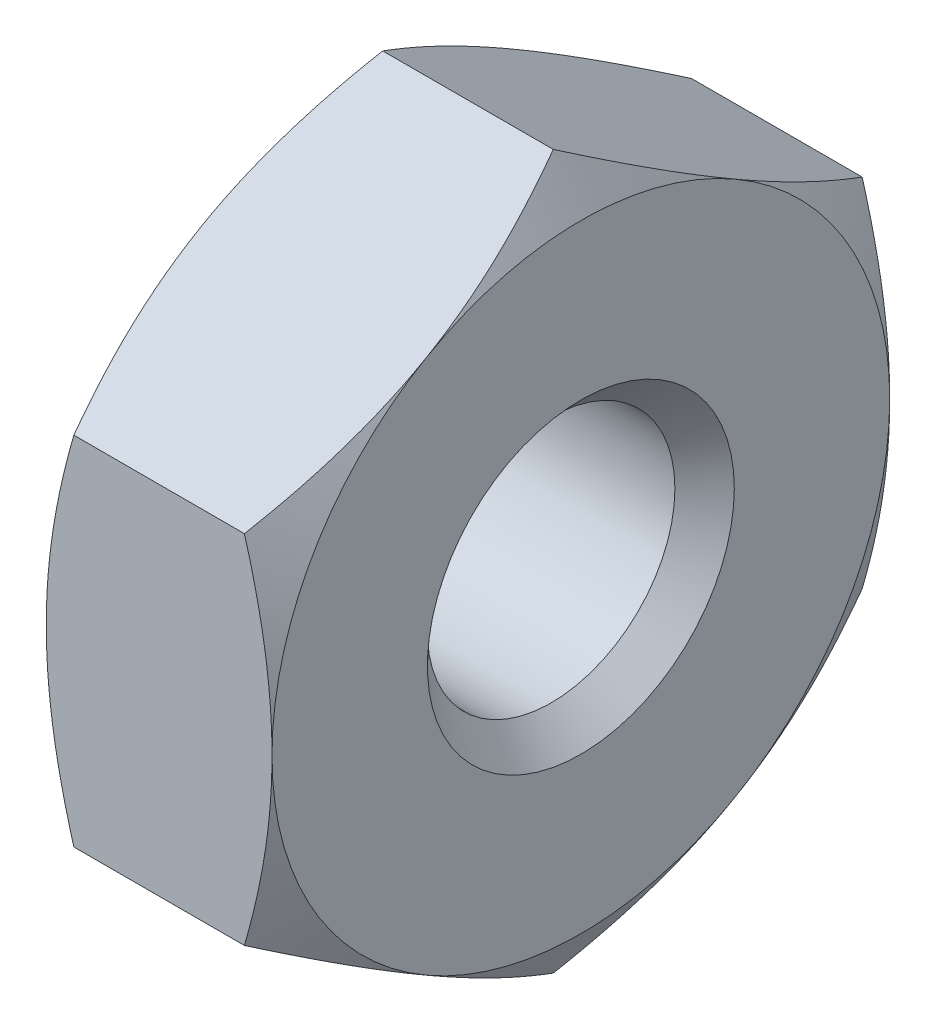
ISO-10303-21;
HEADER;
FILE_DESCRIPTION(('STEP AP214'),'2;1');
FILE_NAME('part.step','',(''),(''),'','','');
FILE_SCHEMA(('AUTOMOTIVE_DESIGN { 1 0 10303 214 1 1 1 1 }'));
ENDSEC;
DATA;
#1=APPLICATION_CONTEXT('core data for automotive mechanical design processes');
#2=APPLICATION_PROTOCOL_DEFINITION('international standard','automotive_design',2000,#1);
#3=PRODUCT_CONTEXT('',#1,'mechanical');
#4=PRODUCT('Part','Part','',(#3));
#5=PRODUCT_RELATED_PRODUCT_CATEGORY('part','',(#4));
#6=PRODUCT_DEFINITION_FORMATION('','',#4);
#7=PRODUCT_DEFINITION_CONTEXT('part definition',#1,'design');
#8=PRODUCT_DEFINITION('design','',#6,#7);
#9=PRODUCT_DEFINITION_SHAPE('','',#8);
#10=(LENGTH_UNIT() NAMED_UNIT(*) SI_UNIT(.MILLI.,.METRE.));
#11=(NAMED_UNIT(*) PLANE_ANGLE_UNIT() SI_UNIT($,.RADIAN.));
#12=(NAMED_UNIT(*) SI_UNIT($,.STERADIAN.) SOLID_ANGLE_UNIT());
#13=UNCERTAINTY_MEASURE_WITH_UNIT(LENGTH_MEASURE(1.E-05),#10,'distance_accuracy_value','');
#14=(GEOMETRIC_REPRESENTATION_CONTEXT(3) GLOBAL_UNCERTAINTY_ASSIGNED_CONTEXT((#13)) GLOBAL_UNIT_ASSIGNED_CONTEXT((#10,
#11,#12)) REPRESENTATION_CONTEXT('',''));
#15=CARTESIAN_POINT('',(0.,0.,0.));
#16=DIRECTION('',(0.,0.,1.));
#17=DIRECTION('',(1.,0.,0.));
#18=AXIS2_PLACEMENT_3D('',#15,#16,#17);
#19=CARTESIAN_POINT('',(2.8956,0.,0.));
#20=DIRECTION('',(1.,0.,0.));
#21=DIRECTION('',(0.,0.,-1.));
#22=AXIS2_PLACEMENT_3D('',#19,#20,#21);
#23=PLANE('',#22);
#24=CARTESIAN_POINT('',(2.8956,0.,0.));
#25=DIRECTION('',(1.,0.,0.));
#26=DIRECTION('',(0.,0.,-1.));
#27=AXIS2_PLACEMENT_3D('',#24,#25,#26);
#28=CIRCLE('',#27,1.9685);
#29=CARTESIAN_POINT('',(2.8956,0.,-1.9685));
#30=VERTEX_POINT('',#29);
#31=EDGE_CURVE('E82',#30,#30,#28,.F.);
#32=ORIENTED_EDGE('',*,*,#31,.T.);
#33=EDGE_LOOP('',(#32));
#34=FACE_BOUND('',#33,.T.);
#35=CARTESIAN_POINT('',(2.8956,0.,0.));
#36=DIRECTION('',(1.,0.,0.));
#37=DIRECTION('',(0.,0.,-1.));
#38=AXIS2_PLACEMENT_3D('',#35,#36,#37);
#39=CIRCLE('',#38,3.9624);
#40=CARTESIAN_POINT('',(2.8956,0.,-3.9624));
#41=VERTEX_POINT('',#40);
#42=CARTESIAN_POINT('',(2.8956,-3.43153905995546,-1.9812));
#43=VERTEX_POINT('',#42);
#44=EDGE_CURVE('E167',#41,#43,#39,.F.);
#45=ORIENTED_EDGE('',*,*,#44,.F.);
#46=CARTESIAN_POINT('',(2.8956,3.43153905995546,-1.9812));
#47=VERTEX_POINT('',#46);
#48=EDGE_CURVE('E180',#47,#41,#39,.F.);
#49=ORIENTED_EDGE('',*,*,#48,.F.);
#50=CARTESIAN_POINT('',(2.8956,3.43153905995546,1.9812));
#51=VERTEX_POINT('',#50);
#52=EDGE_CURVE('E186',#51,#47,#39,.F.);
#53=ORIENTED_EDGE('',*,*,#52,.F.);
#54=CARTESIAN_POINT('',(2.8956,0.,0.));
#55=DIRECTION('',(-1.,0.,0.));
#56=DIRECTION('',(0.,0.,1.));
#57=AXIS2_PLACEMENT_3D('',#54,#55,#56);
#58=CIRCLE('',#57,3.9624);
#59=CARTESIAN_POINT('',(2.8956,0.,3.9624));
#60=VERTEX_POINT('',#59);
#61=EDGE_CURVE('E625',#60,#51,#58,.T.);
#62=ORIENTED_EDGE('',*,*,#61,.F.);
#63=CARTESIAN_POINT('',(2.8956,-3.43153905995546,1.9812));
#64=VERTEX_POINT('',#63);
#65=EDGE_CURVE('E622',#64,#60,#39,.F.);
#66=ORIENTED_EDGE('',*,*,#65,.F.);
#67=EDGE_CURVE('E190',#43,#64,#39,.F.);
#68=ORIENTED_EDGE('',*,*,#67,.F.);
#69=EDGE_LOOP('',(#45,#49,#53,#62,#66,#68));
#70=FACE_BOUND('',#69,.T.);
#71=ADVANCED_FACE('F73',(#34,#70),#23,.T.);
#72=CARTESIAN_POINT('',(0.,0.,0.));
#73=DIRECTION('',(1.,0.,0.));
#74=DIRECTION('',(0.,0.,-1.));
#75=AXIS2_PLACEMENT_3D('',#72,#73,#74);
#76=PLANE('',#75);
#77=CARTESIAN_POINT('',(0.,0.,0.));
#78=DIRECTION('',(1.,0.,0.));
#79=DIRECTION('',(0.,0.,-1.));
#80=AXIS2_PLACEMENT_3D('',#77,#78,#79);
#81=CIRCLE('',#80,1.9685);
#82=CARTESIAN_POINT('',(0.,0.,-1.9685));
#83=VERTEX_POINT('',#82);
#84=EDGE_CURVE('E13',#83,#83,#81,.T.);
#85=ORIENTED_EDGE('',*,*,#84,.T.);
#86=EDGE_LOOP('',(#85));
#87=FACE_BOUND('',#86,.T.);
#88=CARTESIAN_POINT('',(0.,0.,0.));
#89=DIRECTION('',(-1.,0.,0.));
#90=DIRECTION('',(0.,0.,1.));
#91=AXIS2_PLACEMENT_3D('',#88,#89,#90);
#92=CIRCLE('',#91,3.9624);
#93=CARTESIAN_POINT('',(0.,3.43153905995546,-1.9812));
#94=VERTEX_POINT('',#93);
#95=CARTESIAN_POINT('',(0.,0.,-3.9624));
#96=VERTEX_POINT('',#95);
#97=EDGE_CURVE('E362',#94,#96,#92,.T.);
#98=ORIENTED_EDGE('',*,*,#97,.T.);
#99=CARTESIAN_POINT('',(0.,-3.43153905995546,-1.9812));
#100=VERTEX_POINT('',#99);
#101=EDGE_CURVE('E364',#96,#100,#92,.T.);
#102=ORIENTED_EDGE('',*,*,#101,.T.);
#103=CARTESIAN_POINT('',(0.,-3.43153905995546,1.9812));
#104=VERTEX_POINT('',#103);
#105=EDGE_CURVE('E198',#100,#104,#92,.T.);
#106=ORIENTED_EDGE('',*,*,#105,.T.);
#107=CARTESIAN_POINT('',(0.,0.,3.9624));
#108=VERTEX_POINT('',#107);
#109=EDGE_CURVE('E196',#104,#108,#92,.T.);
#110=ORIENTED_EDGE('',*,*,#109,.T.);
#111=CARTESIAN_POINT('',(0.,3.43153905995546,1.9812));
#112=VERTEX_POINT('',#111);
#113=EDGE_CURVE('E200',#108,#112,#92,.T.);
#114=ORIENTED_EDGE('',*,*,#113,.T.);
#115=EDGE_CURVE('E366',#112,#94,#92,.T.);
#116=ORIENTED_EDGE('',*,*,#115,.T.);
#117=EDGE_LOOP('',(#98,#102,#106,#110,#114,#116));
#118=FACE_BOUND('',#117,.T.);
#119=ADVANCED_FACE('F303',(#87,#118),#76,.F.);
#120=CARTESIAN_POINT('',(2.8956,-2.28769270663697,3.9624));
#121=DIRECTION('',(0.,0.866025403784439,-0.499999999999999));
#122=DIRECTION('',(0.,0.499999999999999,0.866025403784439));
#123=AXIS2_PLACEMENT_3D('',#120,#121,#122);
#124=PLANE('',#123);
#125=DIRECTION('',(-1.,0.,0.));
#126=VECTOR('',#125,1.);
#127=CARTESIAN_POINT('',(2.8956,-4.57538541327394,0.));
#128=LINE('',#127,#126);
#129=CARTESIAN_POINT('',(2.54169270663698,-4.57538541327394,0.));
#130=VERTEX_POINT('',#129);
#131=CARTESIAN_POINT('',(0.353907293363023,-4.57538541327394,0.));
#132=VERTEX_POINT('',#131);
#133=EDGE_CURVE('E343',#130,#132,#128,.T.);
#134=ORIENTED_EDGE('',*,*,#133,.F.);
#135=CARTESIAN_POINT('',(2.54162603744665,-4.57550088332778,-0.00020000000000168));
#136=CARTESIAN_POINT('',(2.5996894991212,-4.47496869496618,0.173926858038369));
#137=CARTESIAN_POINT('',(2.65249601498795,-4.37356871848328,0.349556769193048));
#138=CARTESIAN_POINT('',(2.74467012185692,-4.16901293390611,0.703857781062829));
#139=CARTESIAN_POINT('',(2.78400510539269,-4.06585349125788,0.882535177010038));
#140=CARTESIAN_POINT('',(2.84523546926796,-3.8608130677357,1.2376756081559));
#141=CARTESIAN_POINT('',(2.86753837460415,-3.75896363405663,1.41408400201017));
#142=CARTESIAN_POINT('',(2.89416294973538,-3.5547855524458,1.76773081315208));
#143=CARTESIAN_POINT('',(2.89850666746162,-3.45245764660112,1.94496794510718));
#144=CARTESIAN_POINT('',(2.88946818984585,-3.26125371237131,2.27614287380026));
#145=CARTESIAN_POINT('',(2.87830524671096,-3.17234905538404,2.43013025673172));
#146=CARTESIAN_POINT('',(2.84292590299917,-2.99511895214281,2.7371018001762));
#147=CARTESIAN_POINT('',(2.81869741783093,-2.90679411885186,2.89008489900617));
#148=CARTESIAN_POINT('',(2.75812832849033,-2.72919862756264,3.19768931311426));
#149=CARTESIAN_POINT('',(2.72153098455844,-2.63995044607733,3.35227169792995));
#150=CARTESIAN_POINT('',(2.63846950108705,-2.46278516738017,3.65913096197053));
#151=CARTESIAN_POINT('',(2.59202487701409,-2.37486580057578,3.81141177224502));
#152=CARTESIAN_POINT('',(2.54162603744665,-2.28757723658314,3.9626));
#153=B_SPLINE_CURVE_WITH_KNOTS('',3,(#135,#136,#137,#138,#139,#140,#141,#142,#143,#144,#145,
#146,#147,#148,#149,#150,#151,#152),.UNSPECIFIED.,.F.,.F.,(4,2,2,2,2,2,2,2,4),(0.,
0.628087934683978,1.25768556849603,1.87170106915143,2.48496253800265,3.01893254763583,
3.55339728643647,4.09971704494744,4.64496405448818),.UNSPECIFIED.);
#154=EDGE_CURVE('E621',#130,#64,#153,.T.);
#155=ORIENTED_EDGE('',*,*,#154,.T.);
#156=CARTESIAN_POINT('',(2.54169270663697,-2.28769270663697,3.9624));
#157=VERTEX_POINT('',#156);
#158=EDGE_CURVE('E97',#64,#157,#153,.T.);
#159=ORIENTED_EDGE('',*,*,#158,.T.);
#160=DIRECTION('',(-1.,0.,0.));
#161=VECTOR('',#160,1.);
#162=CARTESIAN_POINT('',(2.8956,-2.28769270663697,3.9624));
#163=LINE('',#162,#161);
#164=CARTESIAN_POINT('',(0.353907293363025,-2.28769270663697,3.9624));
#165=VERTEX_POINT('',#164);
#166=EDGE_CURVE('E379',#157,#165,#163,.T.);
#167=ORIENTED_EDGE('',*,*,#166,.T.);
#168=CARTESIAN_POINT('',(0.353973962553349,-4.57550088332778,-0.000200000000001666));
#169=CARTESIAN_POINT('',(0.2959105008788,-4.47496869496618,0.173926858038369));
#170=CARTESIAN_POINT('',(0.243103985012051,-4.37356871848328,0.349556769193048));
#171=CARTESIAN_POINT('',(0.150929878143084,-4.16901293390611,0.703857781062829));
#172=CARTESIAN_POINT('',(0.111594894607311,-4.06585349125788,0.882535177010038));
#173=CARTESIAN_POINT('',(0.0503645307320357,-3.8608130677357,1.2376756081559));
#174=CARTESIAN_POINT('',(0.0280616253958538,-3.75896363405663,1.41408400201017));
#175=CARTESIAN_POINT('',(0.00143705026462416,-3.5547855524458,1.76773081315208));
#176=CARTESIAN_POINT('',(-0.00290666746161531,-3.45245764660112,1.94496794510718));
#177=CARTESIAN_POINT('',(0.00613181015415201,-3.26125371237131,2.27614287380026));
#178=CARTESIAN_POINT('',(0.0172947532890406,-3.17234905538404,2.43013025673172));
#179=CARTESIAN_POINT('',(0.052674097000834,-2.99511895214281,2.7371018001762));
#180=CARTESIAN_POINT('',(0.0769025821690729,-2.90679411885186,2.89008489900617));
#181=CARTESIAN_POINT('',(0.137471671509675,-2.72919862756264,3.19768931311426));
#182=CARTESIAN_POINT('',(0.174069015441556,-2.63995044607733,3.35227169792995));
#183=CARTESIAN_POINT('',(0.257130498912947,-2.46278516738017,3.65913096197053));
#184=CARTESIAN_POINT('',(0.303575122985905,-2.37486580057578,3.81141177224502));
#185=CARTESIAN_POINT('',(0.353973962553351,-2.28757723658314,3.9626));
#186=B_SPLINE_CURVE_WITH_KNOTS('',3,(#168,#169,#170,#171,#172,#173,#174,#175,#176,#177,#178,
#179,#180,#181,#182,#183,#184,#185),.UNSPECIFIED.,.F.,.F.,(4,2,2,2,2,2,2,2,4),(0.,
0.628087934683978,1.25768556849603,1.87170106915143,2.48496253800265,3.01893254763583,
3.55339728643647,4.09971704494744,4.64496405448818),.UNSPECIFIED.);
#187=EDGE_CURVE('E277',#104,#165,#186,.T.);
#188=ORIENTED_EDGE('',*,*,#187,.F.);
#189=EDGE_CURVE('E374',#132,#104,#186,.T.);
#190=ORIENTED_EDGE('',*,*,#189,.F.);
#191=EDGE_LOOP('',(#134,#155,#159,#167,#188,#190));
#192=FACE_BOUND('',#191,.T.);
#193=ADVANCED_FACE('F298',(#192),#124,.F.);
#194=CARTESIAN_POINT('',(2.8956,-4.57538541327394,0.));
#195=DIRECTION('',(0.,0.866025403784439,0.5));
#196=DIRECTION('',(0.,-0.5,0.866025403784439));
#197=AXIS2_PLACEMENT_3D('',#194,#195,#196);
#198=PLANE('',#197);
#199=DIRECTION('',(-1.,0.,0.));
#200=VECTOR('',#199,1.);
#201=CARTESIAN_POINT('',(2.8956,-2.28769270663697,-3.9624));
#202=LINE('',#201,#200);
#203=CARTESIAN_POINT('',(2.54169270663698,-2.28769270663697,-3.9624));
#204=VERTEX_POINT('',#203);
#205=CARTESIAN_POINT('',(0.353907293363024,-2.28769270663697,-3.9624));
#206=VERTEX_POINT('',#205);
#207=EDGE_CURVE('E407',#204,#206,#202,.T.);
#208=ORIENTED_EDGE('',*,*,#207,.F.);
#209=CARTESIAN_POINT('',(2.54162603744665,-2.28757723658313,-3.9626));
#210=CARTESIAN_POINT('',(2.5996894991212,-2.38810942494473,-3.78847314196163));
#211=CARTESIAN_POINT('',(2.65249601498795,-2.48950940142764,-3.61284323080695));
#212=CARTESIAN_POINT('',(2.74467012185691,-2.69406518600481,-3.25854221893717));
#213=CARTESIAN_POINT('',(2.78400510539269,-2.79722462865303,-3.07986482298996));
#214=CARTESIAN_POINT('',(2.84523546926796,-3.00226505217521,-2.7247243918441));
#215=CARTESIAN_POINT('',(2.86753837460415,-3.10411448585428,-2.54831599798983));
#216=CARTESIAN_POINT('',(2.89416294973538,-3.30829256746512,-2.19466918684792));
#217=CARTESIAN_POINT('',(2.89850666746162,-3.41062047330979,-2.01743205489282));
#218=CARTESIAN_POINT('',(2.88946818984585,-3.6018244075396,-1.68625712619973));
#219=CARTESIAN_POINT('',(2.87830524671096,-3.69072906452688,-1.53226974326828));
#220=CARTESIAN_POINT('',(2.84292590299917,-3.86795916776811,-1.2252981998238));
#221=CARTESIAN_POINT('',(2.81869741783093,-3.95628400105906,-1.07231510099383));
#222=CARTESIAN_POINT('',(2.75812832849033,-4.13387949234828,-0.764710686885743));
#223=CARTESIAN_POINT('',(2.72153098455844,-4.22312767383359,-0.610128302070049));
#224=CARTESIAN_POINT('',(2.63846950108705,-4.40029295253075,-0.303269038029472));
#225=CARTESIAN_POINT('',(2.5920248770141,-4.48821231933514,-0.150988227754982));
#226=CARTESIAN_POINT('',(2.54162603744665,-4.57550088332778,0.000199999999998811));
#227=B_SPLINE_CURVE_WITH_KNOTS('',3,(#209,#210,#211,#212,#213,#214,#215,#216,#217,#218,#219,
#220,#221,#222,#223,#224,#225,#226),.UNSPECIFIED.,.F.,.F.,(4,2,2,2,2,2,2,2,4),(0.,
0.628087934683978,1.25768556849603,1.87170106915143,2.48496253800265,3.01893254763583,
3.55339728643647,4.09971704494744,4.64496405448818),.UNSPECIFIED.);
#228=EDGE_CURVE('E170',#204,#43,#227,.T.);
#229=ORIENTED_EDGE('',*,*,#228,.T.);
#230=EDGE_CURVE('E89',#43,#130,#227,.T.);
#231=ORIENTED_EDGE('',*,*,#230,.T.);
#232=ORIENTED_EDGE('',*,*,#133,.T.);
#233=CARTESIAN_POINT('',(0.35397396255335,-2.28757723658313,-3.9626));
#234=CARTESIAN_POINT('',(0.295910500878801,-2.38810942494473,-3.78847314196163));
#235=CARTESIAN_POINT('',(0.243103985012052,-2.48950940142764,-3.61284323080695));
#236=CARTESIAN_POINT('',(0.150929878143085,-2.69406518600481,-3.25854221893717));
#237=CARTESIAN_POINT('',(0.111594894607312,-2.79722462865303,-3.07986482298996));
#238=CARTESIAN_POINT('',(0.0503645307320365,-3.00226505217521,-2.7247243918441));
#239=CARTESIAN_POINT('',(0.0280616253958544,-3.10411448585428,-2.54831599798983));
#240=CARTESIAN_POINT('',(0.00143705026462438,-3.30829256746512,-2.19466918684792));
#241=CARTESIAN_POINT('',(-0.00290666746161511,-3.41062047330979,-2.01743205489282));
#242=CARTESIAN_POINT('',(0.00613181015415195,-3.6018244075396,-1.68625712619973));
#243=CARTESIAN_POINT('',(0.0172947532890404,-3.69072906452688,-1.53226974326828));
#244=CARTESIAN_POINT('',(0.0526740970008337,-3.86795916776811,-1.2252981998238));
#245=CARTESIAN_POINT('',(0.0769025821690728,-3.95628400105906,-1.07231510099383));
#246=CARTESIAN_POINT('',(0.137471671509675,-4.13387949234828,-0.764710686885743));
#247=CARTESIAN_POINT('',(0.174069015441555,-4.22312767383359,-0.610128302070049));
#248=CARTESIAN_POINT('',(0.257130498912946,-4.40029295253075,-0.303269038029472));
#249=CARTESIAN_POINT('',(0.303575122985904,-4.48821231933514,-0.150988227754982));
#250=CARTESIAN_POINT('',(0.35397396255335,-4.57550088332778,0.000199999999998811));
#251=B_SPLINE_CURVE_WITH_KNOTS('',3,(#233,#234,#235,#236,#237,#238,#239,#240,#241,#242,#243,
#244,#245,#246,#247,#248,#249,#250),.UNSPECIFIED.,.F.,.F.,(4,2,2,2,2,2,2,2,4),(0.,
0.628087934683978,1.25768556849603,1.87170106915143,2.48496253800265,3.01893254763583,
3.55339728643647,4.09971704494744,4.64496405448818),.UNSPECIFIED.);
#252=EDGE_CURVE('E274',#100,#132,#251,.T.);
#253=ORIENTED_EDGE('',*,*,#252,.F.);
#254=EDGE_CURVE('E288',#206,#100,#251,.T.);
#255=ORIENTED_EDGE('',*,*,#254,.F.);
#256=EDGE_LOOP('',(#208,#229,#231,#232,#253,#255));
#257=FACE_BOUND('',#256,.T.);
#258=ADVANCED_FACE('F295',(#257),#198,.F.);
#259=CARTESIAN_POINT('',(2.8956,-2.28769270663697,-3.9624));
#260=DIRECTION('',(0.,0.,1.));
#261=DIRECTION('',(0.,-1.,0.));
#262=AXIS2_PLACEMENT_3D('',#259,#260,#261);
#263=PLANE('',#262);
#264=DIRECTION('',(-1.,0.,0.));
#265=VECTOR('',#264,1.);
#266=CARTESIAN_POINT('',(2.8956,2.28769270663697,-3.9624));
#267=LINE('',#266,#265);
#268=CARTESIAN_POINT('',(2.54169270663698,2.28769270663697,-3.9624));
#269=VERTEX_POINT('',#268);
#270=CARTESIAN_POINT('',(0.353907293363024,2.28769270663697,-3.9624));
#271=VERTEX_POINT('',#270);
#272=EDGE_CURVE('E195',#269,#271,#267,.T.);
#273=ORIENTED_EDGE('',*,*,#272,.F.);
#274=CARTESIAN_POINT('',(0.182289948209158,7.70256269104045,-3.9624));
#275=CARTESIAN_POINT('',(0.274606353263149,7.52272497184072,-3.9624));
#276=CARTESIAN_POINT('',(0.366407238824421,7.34262025346435,-3.9624));
#277=CARTESIAN_POINT('',(0.548719844270929,6.98175542812287,-3.9624));
#278=CARTESIAN_POINT('',(0.639231538678051,6.80099530829347,-3.9624));
#279=CARTESIAN_POINT('',(0.818853443103621,6.43840364833198,-3.9624));
#280=CARTESIAN_POINT('',(0.907961067564235,6.25657082507101,-3.9624));
#281=CARTESIAN_POINT('',(1.08426553414595,5.89197647389006,-3.9624));
#282=CARTESIAN_POINT('',(1.17146234874555,5.70921493264035,-3.9624));
#283=CARTESIAN_POINT('',(1.34795240446268,5.33306014822794,-3.9624));
#284=CARTESIAN_POINT('',(1.43711946956753,5.13960753557344,-3.9624));
#285=CARTESIAN_POINT('',(1.61211975184191,4.75120693210959,-3.9624));
#286=CARTESIAN_POINT('',(1.69795314000825,4.55625901861571,-3.9624));
#287=CARTESIAN_POINT('',(1.86527992120165,4.16465576275669,-3.9624));
#288=CARTESIAN_POINT('',(1.9467762086188,3.96800166359602,-3.9624));
#289=CARTESIAN_POINT('',(2.10421175246153,3.57241334445207,-3.9624));
#290=CARTESIAN_POINT('',(2.18014968539791,3.37347859438533,-3.9624));
#291=CARTESIAN_POINT('',(2.33689351512035,2.93918281435936,-3.9624));
#292=CARTESIAN_POINT('',(2.41636264061333,2.70333360112805,-3.9624));
#293=CARTESIAN_POINT('',(2.56150192237576,2.22743533132434,-3.9624));
#294=CARTESIAN_POINT('',(2.62717919348315,1.98738850976269,-3.9624));
#295=CARTESIAN_POINT('',(2.7111951154525,1.62634331124381,-3.9624));
#296=CARTESIAN_POINT('',(2.73660660323574,1.50698440014674,-3.9624));
#297=CARTESIAN_POINT('',(2.78233226293366,1.26728597187931,-3.9624));
#298=CARTESIAN_POINT('',(2.80264656374962,1.14694647958607,-3.9624));
#299=CARTESIAN_POINT('',(2.83759555505393,0.905492991729085,-3.9624));
#300=CARTESIAN_POINT('',(2.85223276376496,0.784379363842824,-3.9624));
#301=CARTESIAN_POINT('',(2.87536599604673,0.541568023368281,-3.9624));
#302=CARTESIAN_POINT('',(2.88386238616633,0.419870346078813,-3.9624));
#303=CARTESIAN_POINT('',(2.894481081469,0.174637610857229,-3.9624));
#304=CARTESIAN_POINT('',(2.89652067296957,0.0510989218939636,-3.9624));
#305=CARTESIAN_POINT('',(2.89391554504624,-0.195906835324923,-3.9624));
#306=CARTESIAN_POINT('',(2.88927081490336,-0.319373903465375,-3.9624));
#307=CARTESIAN_POINT('',(2.87346861657513,-0.565916129075409,-3.9624));
#308=CARTESIAN_POINT('',(2.86230962630852,-0.688991188190953,-3.9624));
#309=CARTESIAN_POINT('',(2.83387315400649,-0.934439508744345,-3.9624));
#310=CARTESIAN_POINT('',(2.81659469959799,-1.05681265550732,-3.9624));
#311=CARTESIAN_POINT('',(2.75558987521174,-1.42734959834767,-3.9624));
#312=CARTESIAN_POINT('',(2.70303858556925,-1.67407818673978,-3.9624));
#313=CARTESIAN_POINT('',(2.58007371839412,-2.16293128009702,-3.9624));
#314=CARTESIAN_POINT('',(2.50965526515473,-2.40505450890363,-3.9624));
#315=CARTESIAN_POINT('',(2.3602472122273,-2.87114242215661,-3.9624));
#316=CARTESIAN_POINT('',(2.28199113151834,-3.09534609314044,-3.9624));
#317=CARTESIAN_POINT('',(2.11694852039893,-3.54061146906983,-3.9624));
#318=CARTESIAN_POINT('',(2.03016009682278,-3.76167246420437,-3.9624));
#319=CARTESIAN_POINT('',(1.85019857157568,-4.2014272519529,-3.9624));
#320=CARTESIAN_POINT('',(1.75701895819249,-4.42011835928111,-3.9624));
#321=CARTESIAN_POINT('',(1.56594858890574,-4.85539795505858,-3.9624));
#322=CARTESIAN_POINT('',(1.46805826315899,-5.07198663332803,-3.9624));
#323=CARTESIAN_POINT('',(1.27418580524747,-5.49159898606032,-3.9624));
#324=CARTESIAN_POINT('',(1.17839620920984,-5.69471196773203,-3.9624));
#325=CARTESIAN_POINT('',(0.984298664103829,-6.09973608782074,-3.9624));
#326=CARTESIAN_POINT('',(0.885990638182508,-6.30164718932864,-3.9624));
#327=CARTESIAN_POINT('',(0.687687341744048,-6.70385965514922,-3.9624));
#328=CARTESIAN_POINT('',(0.587698241260454,-6.90416406847561,-3.9624));
#329=CARTESIAN_POINT('',(0.386111251183596,-7.30394148741969,-3.9624));
#330=CARTESIAN_POINT('',(0.28451349563511,-7.5034145605791,-3.9624));
#331=CARTESIAN_POINT('',(0.182289948209156,-7.70256269104045,-3.9624));
#332=B_SPLINE_CURVE_WITH_KNOTS('',3,(#274,#275,#276,#277,#278,#279,#280,#281,#282,#283,#284,
#285,#286,#287,#288,#289,#290,#291,#292,#293,#294,#295,#296,#297,#298,#299,#300,#301,#302,#303,
#304,#305,#306,#307,#308,#309,#310,#311,#312,#313,#314,#315,#316,#317,#318,#319,#320,#321,#322,
#323,#324,#325,#326,#327,#328,#329,#330,#331),.UNSPECIFIED.,.F.,.F.,(4,2,2,2,2,2,2,2,2,2,2,2,2,
2,2,2,2,2,2,2,2,2,2,2,2,2,2,2,4),(0.,0.60644712097485,1.21290621050109,1.82037547020059,
2.42785347357265,3.06686887199352,3.70585144951122,4.34440210851369,4.98310432030336,
5.7294578821321,6.4754254696883,6.84143647309758,7.20743821962664,7.57327743032472,
7.93909480207339,8.30957983680194,8.68006546564152,9.05063769450259,9.42126883313732,
10.1770644799548,10.9330665953962,11.6452429549003,12.3575776910582,13.0706492965039,
13.7836559112031,14.4573372133535,15.1310390982522,15.8026540224422,16.4742132743026),.UNSPECIFIED.);
#333=EDGE_CURVE('E174',#269,#41,#332,.T.);
#334=ORIENTED_EDGE('',*,*,#333,.T.);
#335=EDGE_CURVE('E163',#41,#204,#332,.T.);
#336=ORIENTED_EDGE('',*,*,#335,.T.);
#337=ORIENTED_EDGE('',*,*,#207,.T.);
#338=CARTESIAN_POINT('',(2.71331005179084,7.70256269104045,-3.9624));
#339=CARTESIAN_POINT('',(2.62099364673685,7.52272497184072,-3.9624));
#340=CARTESIAN_POINT('',(2.52919276117558,7.34262025346435,-3.9624));
#341=CARTESIAN_POINT('',(2.34688015572907,6.98175542812287,-3.9624));
#342=CARTESIAN_POINT('',(2.25636846132195,6.80099530829348,-3.9624));
#343=CARTESIAN_POINT('',(2.07674655689638,6.43840364833199,-3.9624));
#344=CARTESIAN_POINT('',(1.98763893243576,6.25657082507101,-3.9624));
#345=CARTESIAN_POINT('',(1.81133446585405,5.89197647389006,-3.9624));
#346=CARTESIAN_POINT('',(1.72413765125445,5.70921493264035,-3.9624));
#347=CARTESIAN_POINT('',(1.54764759553732,5.33306014822794,-3.9624));
#348=CARTESIAN_POINT('',(1.45848053043247,5.13960753557344,-3.9624));
#349=CARTESIAN_POINT('',(1.28348024815809,4.75120693210959,-3.9624));
#350=CARTESIAN_POINT('',(1.19764685999175,4.55625901861571,-3.9624));
#351=CARTESIAN_POINT('',(1.03032007879835,4.16465576275669,-3.9624));
#352=CARTESIAN_POINT('',(0.9488237913812,3.96800166359602,-3.9624));
#353=CARTESIAN_POINT('',(0.791388247538468,3.57241334445207,-3.9624));
#354=CARTESIAN_POINT('',(0.715450314602091,3.37347859438533,-3.9624));
#355=CARTESIAN_POINT('',(0.558706484879653,2.93918281435936,-3.9624));
#356=CARTESIAN_POINT('',(0.479237359386666,2.70333360112805,-3.9624));
#357=CARTESIAN_POINT('',(0.334098077624243,2.22743533132434,-3.9624));
#358=CARTESIAN_POINT('',(0.268420806516853,1.98738850976269,-3.9624));
#359=CARTESIAN_POINT('',(0.184404884547504,1.62634331124381,-3.9624));
#360=CARTESIAN_POINT('',(0.158993396764256,1.50698440014674,-3.9624));
#361=CARTESIAN_POINT('',(0.113267737066343,1.26728597187931,-3.9624));
#362=CARTESIAN_POINT('',(0.0929534362503816,1.14694647958607,-3.9624));
#363=CARTESIAN_POINT('',(0.0580044449460747,0.905492991729085,-3.9624));
#364=CARTESIAN_POINT('',(0.0433672362350353,0.784379363842825,-3.9624));
#365=CARTESIAN_POINT('',(0.0202340039532675,0.541568023368281,-3.9624));
#366=CARTESIAN_POINT('',(0.0117376138336693,0.419870346078813,-3.9624));
#367=CARTESIAN_POINT('',(0.00111891853099631,0.17463761085723,-3.9624));
#368=CARTESIAN_POINT('',(-0.000920672969569272,0.0510989218939641,-3.9624));
#369=CARTESIAN_POINT('',(0.0016844549537588,-0.195906835324923,-3.9624));
#370=CARTESIAN_POINT('',(0.00632918509664104,-0.319373903465375,-3.9624));
#371=CARTESIAN_POINT('',(0.022131383424871,-0.565916129075409,-3.9624));
#372=CARTESIAN_POINT('',(0.0332903736914801,-0.688991188190952,-3.9624));
#373=CARTESIAN_POINT('',(0.0617268459935065,-0.934439508744344,-3.9624));
#374=CARTESIAN_POINT('',(0.0790053004020125,-1.05681265550732,-3.9624));
#375=CARTESIAN_POINT('',(0.140010124788258,-1.42734959834767,-3.9624));
#376=CARTESIAN_POINT('',(0.192561414430751,-1.67407818673978,-3.9624));
#377=CARTESIAN_POINT('',(0.315526281605878,-2.16293128009702,-3.9624));
#378=CARTESIAN_POINT('',(0.385944734845269,-2.40505450890363,-3.9624));
#379=CARTESIAN_POINT('',(0.535352787772696,-2.87114242215661,-3.9624));
#380=CARTESIAN_POINT('',(0.613608868481664,-3.09534609314044,-3.9624));
#381=CARTESIAN_POINT('',(0.778651479601071,-3.54061146906983,-3.9624));
#382=CARTESIAN_POINT('',(0.865439903177224,-3.76167246420437,-3.9624));
#383=CARTESIAN_POINT('',(1.04540142842432,-4.2014272519529,-3.9624));
#384=CARTESIAN_POINT('',(1.13858104180751,-4.42011835928111,-3.9624));
#385=CARTESIAN_POINT('',(1.32965141109426,-4.85539795505858,-3.9624));
#386=CARTESIAN_POINT('',(1.42754173684101,-5.07198663332803,-3.9624));
#387=CARTESIAN_POINT('',(1.62141419475253,-5.49159898606032,-3.9624));
#388=CARTESIAN_POINT('',(1.71720379079016,-5.69471196773203,-3.9624));
#389=CARTESIAN_POINT('',(1.91130133589617,-6.09973608782074,-3.9624));
#390=CARTESIAN_POINT('',(2.00960936181749,-6.30164718932864,-3.9624));
#391=CARTESIAN_POINT('',(2.20791265825595,-6.70385965514922,-3.9624));
#392=CARTESIAN_POINT('',(2.30790175873955,-6.90416406847561,-3.9624));
#393=CARTESIAN_POINT('',(2.5094887488164,-7.30394148741968,-3.9624));
#394=CARTESIAN_POINT('',(2.61108650436489,-7.50341456057909,-3.9624));
#395=CARTESIAN_POINT('',(2.71331005179084,-7.70256269104045,-3.9624));
#396=B_SPLINE_CURVE_WITH_KNOTS('',3,(#338,#339,#340,#341,#342,#343,#344,#345,#346,#347,#348,
#349,#350,#351,#352,#353,#354,#355,#356,#357,#358,#359,#360,#361,#362,#363,#364,#365,#366,#367,
#368,#369,#370,#371,#372,#373,#374,#375,#376,#377,#378,#379,#380,#381,#382,#383,#384,#385,#386,
#387,#388,#389,#390,#391,#392,#393,#394,#395),.UNSPECIFIED.,.F.,.F.,(4,2,2,2,2,2,2,2,2,2,2,2,2,
2,2,2,2,2,2,2,2,2,2,2,2,2,2,2,4),(0.,0.60644712097485,1.21290621050108,1.82037547020059,
2.42785347357265,3.06686887199352,3.70585144951122,4.34440210851369,4.98310432030336,
5.7294578821321,6.4754254696883,6.84143647309758,7.20743821962664,7.57327743032471,
7.93909480207339,8.30957983680193,8.68006546564152,9.05063769450258,9.42126883313731,
10.1770644799548,10.9330665953962,11.6452429549003,12.3575776910582,13.0706492965039,
13.7836559112031,14.4573372133535,15.1310390982522,15.8026540224422,16.4742132743026),.UNSPECIFIED.);
#397=EDGE_CURVE('E289',#96,#206,#396,.T.);
#398=ORIENTED_EDGE('',*,*,#397,.F.);
#399=EDGE_CURVE('E401',#271,#96,#396,.T.);
#400=ORIENTED_EDGE('',*,*,#399,.F.);
#401=EDGE_LOOP('',(#273,#334,#336,#337,#398,#400));
#402=FACE_BOUND('',#401,.T.);
#403=ADVANCED_FACE('F193',(#402),#263,.F.);
#404=CARTESIAN_POINT('',(2.8956,2.28769270663697,-3.9624));
#405=DIRECTION('',(0.,-0.866025403784439,0.5));
#406=DIRECTION('',(0.,-0.5,-0.866025403784439));
#407=AXIS2_PLACEMENT_3D('',#404,#405,#406);
#408=PLANE('',#407);
#409=DIRECTION('',(-1.,0.,0.));
#410=VECTOR('',#409,1.);
#411=CARTESIAN_POINT('',(2.8956,4.57538541327395,0.));
#412=LINE('',#411,#410);
#413=CARTESIAN_POINT('',(2.54169270663698,4.57538541327395,0.));
#414=VERTEX_POINT('',#413);
#415=CARTESIAN_POINT('',(0.353907293363024,4.57538541327395,0.));
#416=VERTEX_POINT('',#415);
#417=EDGE_CURVE('E399',#414,#416,#412,.T.);
#418=ORIENTED_EDGE('',*,*,#417,.F.);
#419=CARTESIAN_POINT('',(2.54162603744665,4.57550088332778,0.000200000000005096));
#420=CARTESIAN_POINT('',(2.5996894991212,4.47496869496619,-0.173926858038365));
#421=CARTESIAN_POINT('',(2.65249601498795,4.37356871848328,-0.349556769193044));
#422=CARTESIAN_POINT('',(2.74467012185691,4.16901293390611,-0.703857781062825));
#423=CARTESIAN_POINT('',(2.78400510539269,4.06585349125789,-0.882535177010034));
#424=CARTESIAN_POINT('',(2.84523546926796,3.8608130677357,-1.23767560815589));
#425=CARTESIAN_POINT('',(2.86753837460415,3.75896363405663,-1.41408400201016));
#426=CARTESIAN_POINT('',(2.89416294973538,3.5547855524458,-1.76773081315207));
#427=CARTESIAN_POINT('',(2.89850666746162,3.45245764660112,-1.94496794510717));
#428=CARTESIAN_POINT('',(2.88946818984585,3.26125371237132,-2.27614287380026));
#429=CARTESIAN_POINT('',(2.87830524671096,3.17234905538404,-2.43013025673171));
#430=CARTESIAN_POINT('',(2.84292590299917,2.99511895214281,-2.73710180017619));
#431=CARTESIAN_POINT('',(2.81869741783093,2.90679411885186,-2.89008489900617));
#432=CARTESIAN_POINT('',(2.75812832849033,2.72919862756264,-3.19768931311425));
#433=CARTESIAN_POINT('',(2.72153098455845,2.63995044607732,-3.35227169792995));
#434=CARTESIAN_POINT('',(2.63846950108705,2.46278516738017,-3.65913096197053));
#435=CARTESIAN_POINT('',(2.5920248770141,2.37486580057578,-3.81141177224502));
#436=CARTESIAN_POINT('',(2.54162603744665,2.28757723658314,-3.9626));
#437=B_SPLINE_CURVE_WITH_KNOTS('',3,(#419,#420,#421,#422,#423,#424,#425,#426,#427,#428,#429,
#430,#431,#432,#433,#434,#435,#436),.UNSPECIFIED.,.F.,.F.,(4,2,2,2,2,2,2,2,4),(0.,
0.628087934683978,1.25768556849603,1.87170106915143,2.48496253800265,3.01893254763583,
3.55339728643648,4.09971704494745,4.64496405448818),.UNSPECIFIED.);
#438=EDGE_CURVE('E252',#414,#47,#437,.T.);
#439=ORIENTED_EDGE('',*,*,#438,.T.);
#440=EDGE_CURVE('E175',#47,#269,#437,.T.);
#441=ORIENTED_EDGE('',*,*,#440,.T.);
#442=ORIENTED_EDGE('',*,*,#272,.T.);
#443=CARTESIAN_POINT('',(0.35397396255335,4.57550088332778,0.000200000000005096));
#444=CARTESIAN_POINT('',(0.295910500878802,4.47496869496619,-0.173926858038365));
#445=CARTESIAN_POINT('',(0.243103985012053,4.37356871848328,-0.349556769193044));
#446=CARTESIAN_POINT('',(0.150929878143085,4.16901293390611,-0.703857781062825));
#447=CARTESIAN_POINT('',(0.111594894607311,4.06585349125789,-0.882535177010034));
#448=CARTESIAN_POINT('',(0.0503645307320359,3.8608130677357,-1.23767560815589));
#449=CARTESIAN_POINT('',(0.0280616253958538,3.75896363405663,-1.41408400201016));
#450=CARTESIAN_POINT('',(0.00143705026462388,3.5547855524458,-1.76773081315207));
#451=CARTESIAN_POINT('',(-0.00290666746161567,3.45245764660112,-1.94496794510717));
#452=CARTESIAN_POINT('',(0.00613181015415127,3.26125371237132,-2.27614287380026));
#453=CARTESIAN_POINT('',(0.0172947532890396,3.17234905538404,-2.43013025673171));
#454=CARTESIAN_POINT('',(0.0526740970008328,2.99511895214281,-2.73710180017619));
#455=CARTESIAN_POINT('',(0.0769025821690718,2.90679411885186,-2.89008489900617));
#456=CARTESIAN_POINT('',(0.137471671509674,2.72919862756264,-3.19768931311425));
#457=CARTESIAN_POINT('',(0.174069015441555,2.63995044607733,-3.35227169792995));
#458=CARTESIAN_POINT('',(0.257130498912946,2.46278516738017,-3.65913096197053));
#459=CARTESIAN_POINT('',(0.303575122985904,2.37486580057578,-3.81141177224502));
#460=CARTESIAN_POINT('',(0.35397396255335,2.28757723658314,-3.9626));
#461=B_SPLINE_CURVE_WITH_KNOTS('',3,(#443,#444,#445,#446,#447,#448,#449,#450,#451,#452,#453,
#454,#455,#456,#457,#458,#459,#460),.UNSPECIFIED.,.F.,.F.,(4,2,2,2,2,2,2,2,4),(0.,
0.628087934683978,1.25768556849603,1.87170106915143,2.48496253800265,3.01893254763584,
3.55339728643648,4.09971704494745,4.64496405448818),.UNSPECIFIED.);
#462=EDGE_CURVE('E276',#94,#271,#461,.T.);
#463=ORIENTED_EDGE('',*,*,#462,.F.);
#464=EDGE_CURVE('E266',#416,#94,#461,.T.);
#465=ORIENTED_EDGE('',*,*,#464,.F.);
#466=EDGE_LOOP('',(#418,#439,#441,#442,#463,#465));
#467=FACE_BOUND('',#466,.T.);
#468=ADVANCED_FACE('F258',(#467),#408,.F.);
#469=CARTESIAN_POINT('',(2.8956,4.57538541327395,0.));
#470=DIRECTION('',(0.,-0.866025403784438,-0.5));
#471=DIRECTION('',(0.,0.500000000000001,-0.866025403784438));
#472=AXIS2_PLACEMENT_3D('',#469,#470,#471);
#473=PLANE('',#472);
#474=DIRECTION('',(-1.,0.,0.));
#475=VECTOR('',#474,1.);
#476=CARTESIAN_POINT('',(2.8956,2.28769270663697,3.9624));
#477=LINE('',#476,#475);
#478=CARTESIAN_POINT('',(2.54169270663697,2.28769270663697,3.9624));
#479=VERTEX_POINT('',#478);
#480=CARTESIAN_POINT('',(0.35390729336301,2.287692706637,3.9624));
#481=VERTEX_POINT('',#480);
#482=EDGE_CURVE('E412',#479,#481,#477,.T.);
#483=ORIENTED_EDGE('',*,*,#482,.F.);
#484=CARTESIAN_POINT('',(2.54162603744665,2.28757723658314,3.9626));
#485=CARTESIAN_POINT('',(2.5996894991212,2.38810942494473,3.78847314196163));
#486=CARTESIAN_POINT('',(2.65249601498795,2.48950940142764,3.61284323080695));
#487=CARTESIAN_POINT('',(2.74467012185691,2.69406518600481,3.25854221893717));
#488=CARTESIAN_POINT('',(2.78400510539269,2.79722462865303,3.07986482298996));
#489=CARTESIAN_POINT('',(2.84523546926796,3.00226505217521,2.7247243918441));
#490=CARTESIAN_POINT('',(2.86753837460415,3.10411448585429,2.54831599798983));
#491=CARTESIAN_POINT('',(2.89416294973537,3.30829256746512,2.19466918684792));
#492=CARTESIAN_POINT('',(2.89850666746161,3.4106204733098,2.01743205489282));
#493=CARTESIAN_POINT('',(2.88946818984585,3.60182440753961,1.68625712619974));
#494=CARTESIAN_POINT('',(2.87830524671096,3.69072906452688,1.53226974326828));
#495=CARTESIAN_POINT('',(2.84292590299916,3.86795916776811,1.2252981998238));
#496=CARTESIAN_POINT('',(2.81869741783093,3.95628400105906,1.07231510099383));
#497=CARTESIAN_POINT('',(2.75812832849032,4.13387949234828,0.764710686885745));
#498=CARTESIAN_POINT('',(2.72153098455844,4.22312767383359,0.610128302070052));
#499=CARTESIAN_POINT('',(2.63846950108705,4.40029295253075,0.303269038029475));
#500=CARTESIAN_POINT('',(2.5920248770141,4.48821231933514,0.150988227754985));
#501=CARTESIAN_POINT('',(2.54162603744665,4.57550088332778,-0.000199999999995203));
#502=B_SPLINE_CURVE_WITH_KNOTS('',3,(#484,#485,#486,#487,#488,#489,#490,#491,#492,#493,#494,
#495,#496,#497,#498,#499,#500,#501),.UNSPECIFIED.,.F.,.F.,(4,2,2,2,2,2,2,2,4),(0.,
0.628087934683977,1.25768556849603,1.87170106915143,2.48496253800265,3.01893254763583,
3.55339728643647,4.09971704494744,4.64496405448818),.UNSPECIFIED.);
#503=EDGE_CURVE('E240',#479,#51,#502,.T.);
#504=ORIENTED_EDGE('',*,*,#503,.T.);
#505=EDGE_CURVE('E257',#51,#414,#502,.T.);
#506=ORIENTED_EDGE('',*,*,#505,.T.);
#507=ORIENTED_EDGE('',*,*,#417,.T.);
#508=CARTESIAN_POINT('',(0.353973962553351,2.28757723658314,3.9626));
#509=CARTESIAN_POINT('',(0.295910500878801,2.38810942494473,3.78847314196163));
#510=CARTESIAN_POINT('',(0.243103985012052,2.48950940142764,3.61284323080695));
#511=CARTESIAN_POINT('',(0.150929878143086,2.69406518600481,3.25854221893717));
#512=CARTESIAN_POINT('',(0.111594894607313,2.79722462865303,3.07986482298996));
#513=CARTESIAN_POINT('',(0.0503645307320375,3.00226505217521,2.7247243918441));
#514=CARTESIAN_POINT('',(0.028061625395855,3.10411448585429,2.54831599798983));
#515=CARTESIAN_POINT('',(0.00143705026462496,3.30829256746512,2.19466918684792));
#516=CARTESIAN_POINT('',(-0.00290666746161431,3.4106204733098,2.01743205489282));
#517=CARTESIAN_POINT('',(0.00613181015415313,3.60182440753961,1.68625712619974));
#518=CARTESIAN_POINT('',(0.0172947532890417,3.69072906452688,1.53226974326828));
#519=CARTESIAN_POINT('',(0.052674097000835,3.86795916776811,1.2252981998238));
#520=CARTESIAN_POINT('',(0.0769025821690739,3.95628400105906,1.07231510099383));
#521=CARTESIAN_POINT('',(0.137471671509675,4.13387949234828,0.764710686885745));
#522=CARTESIAN_POINT('',(0.174069015441556,4.22312767383359,0.610128302070052));
#523=CARTESIAN_POINT('',(0.257130498912947,4.40029295253075,0.303269038029475));
#524=CARTESIAN_POINT('',(0.303575122985905,4.48821231933514,0.150988227754985));
#525=CARTESIAN_POINT('',(0.35397396255335,4.57550088332778,-0.000199999999995204));
#526=B_SPLINE_CURVE_WITH_KNOTS('',3,(#508,#509,#510,#511,#512,#513,#514,#515,#516,#517,#518,
#519,#520,#521,#522,#523,#524,#525),.UNSPECIFIED.,.F.,.F.,(4,2,2,2,2,2,2,2,4),(0.,
0.628087934683978,1.25768556849603,1.87170106915143,2.48496253800265,3.01893254763583,
3.55339728643647,4.09971704494744,4.64496405448818),.UNSPECIFIED.);
#527=EDGE_CURVE('E275',#112,#416,#526,.T.);
#528=ORIENTED_EDGE('',*,*,#527,.F.);
#529=EDGE_CURVE('E382',#481,#112,#526,.T.);
#530=ORIENTED_EDGE('',*,*,#529,.F.);
#531=EDGE_LOOP('',(#483,#504,#506,#507,#528,#530));
#532=FACE_BOUND('',#531,.T.);
#533=ADVANCED_FACE('F261',(#532),#473,.F.);
#534=CARTESIAN_POINT('',(2.8956,2.28769270663697,3.9624));
#535=DIRECTION('',(0.,0.,-1.));
#536=DIRECTION('',(0.,1.,0.));
#537=AXIS2_PLACEMENT_3D('',#534,#535,#536);
#538=PLANE('',#537);
#539=ORIENTED_EDGE('',*,*,#166,.F.);
#540=CARTESIAN_POINT('',(0.182289948209155,-7.70256269104046,3.9624));
#541=CARTESIAN_POINT('',(0.274606353263146,-7.52272497184072,3.9624));
#542=CARTESIAN_POINT('',(0.366407238824418,-7.34262025346435,3.9624));
#543=CARTESIAN_POINT('',(0.548719844270927,-6.98175542812287,3.9624));
#544=CARTESIAN_POINT('',(0.639231538678049,-6.80099530829348,3.9624));
#545=CARTESIAN_POINT('',(0.818853443103619,-6.43840364833199,3.9624));
#546=CARTESIAN_POINT('',(0.907961067564233,-6.25657082507102,3.9624));
#547=CARTESIAN_POINT('',(1.08426553414595,-5.89197647389007,3.9624));
#548=CARTESIAN_POINT('',(1.17146234874555,-5.70921493264035,3.9624));
#549=CARTESIAN_POINT('',(1.34795240446268,-5.33306014822795,3.9624));
#550=CARTESIAN_POINT('',(1.43711946956752,-5.13960753557344,3.9624));
#551=CARTESIAN_POINT('',(1.61211975184191,-4.75120693210959,3.9624));
#552=CARTESIAN_POINT('',(1.69795314000825,-4.55625901861571,3.9624));
#553=CARTESIAN_POINT('',(1.86527992120165,-4.16465576275669,3.9624));
#554=CARTESIAN_POINT('',(1.9467762086188,-3.96800166359602,3.9624));
#555=CARTESIAN_POINT('',(2.10421175246153,-3.57241334445207,3.9624));
#556=CARTESIAN_POINT('',(2.18014968539791,-3.37347859438533,3.9624));
#557=CARTESIAN_POINT('',(2.33689351512034,-2.93918281435937,3.9624));
#558=CARTESIAN_POINT('',(2.41636264061333,-2.70333360112805,3.9624));
#559=CARTESIAN_POINT('',(2.56150192237576,-2.22743533132434,3.9624));
#560=CARTESIAN_POINT('',(2.62717919348314,-1.98738850976269,3.9624));
#561=CARTESIAN_POINT('',(2.71119511545249,-1.62634331124382,3.9624));
#562=CARTESIAN_POINT('',(2.73660660323574,-1.50698440014674,3.9624));
#563=CARTESIAN_POINT('',(2.78233226293366,-1.26728597187932,3.9624));
#564=CARTESIAN_POINT('',(2.80264656374962,-1.14694647958607,3.9624));
#565=CARTESIAN_POINT('',(2.83759555505392,-0.905492991729088,3.9624));
#566=CARTESIAN_POINT('',(2.85223276376496,-0.784379363842827,3.9624));
#567=CARTESIAN_POINT('',(2.87536599604673,-0.541568023368284,3.9624));
#568=CARTESIAN_POINT('',(2.88386238616633,-0.419870346078815,3.9624));
#569=CARTESIAN_POINT('',(2.894481081469,-0.174637610857232,3.9624));
#570=CARTESIAN_POINT('',(2.89652067296957,-0.0510989218939662,3.9624));
#571=CARTESIAN_POINT('',(2.89391554504624,0.195906835324921,3.9624));
#572=CARTESIAN_POINT('',(2.88927081490336,0.319373903465373,3.9624));
#573=CARTESIAN_POINT('',(2.87346861657513,0.565916129075407,3.9624));
#574=CARTESIAN_POINT('',(2.86230962630852,0.688991188190951,3.9624));
#575=CARTESIAN_POINT('',(2.83387315400649,0.934439508744343,3.9624));
#576=CARTESIAN_POINT('',(2.81659469959799,1.05681265550731,3.9624));
#577=CARTESIAN_POINT('',(2.75558987521174,1.42734959834767,3.9624));
#578=CARTESIAN_POINT('',(2.70303858556925,1.67407818673978,3.9624));
#579=CARTESIAN_POINT('',(2.58007371839412,2.16293128009702,3.9624));
#580=CARTESIAN_POINT('',(2.50965526515473,2.40505450890363,3.9624));
#581=CARTESIAN_POINT('',(2.3602472122273,2.87114242215661,3.9624));
#582=CARTESIAN_POINT('',(2.28199113151834,3.09534609314044,3.9624));
#583=CARTESIAN_POINT('',(2.11694852039893,3.54061146906982,3.9624));
#584=CARTESIAN_POINT('',(2.03016009682278,3.76167246420437,3.9624));
#585=CARTESIAN_POINT('',(1.85019857157568,4.2014272519529,3.9624));
#586=CARTESIAN_POINT('',(1.75701895819249,4.42011835928111,3.9624));
#587=CARTESIAN_POINT('',(1.56594858890574,4.85539795505858,3.9624));
#588=CARTESIAN_POINT('',(1.46805826315899,5.07198663332803,3.9624));
#589=CARTESIAN_POINT('',(1.27418580524747,5.49159898606032,3.9624));
#590=CARTESIAN_POINT('',(1.17839620920984,5.69471196773203,3.9624));
#591=CARTESIAN_POINT('',(0.984298664103827,6.09973608782074,3.9624));
#592=CARTESIAN_POINT('',(0.885990638182506,6.30164718932865,3.9624));
#593=CARTESIAN_POINT('',(0.687687341744047,6.70385965514922,3.9624));
#594=CARTESIAN_POINT('',(0.587698241260452,6.90416406847561,3.9624));
#595=CARTESIAN_POINT('',(0.386111251183594,7.30394148741969,3.9624));
#596=CARTESIAN_POINT('',(0.284513495635108,7.5034145605791,3.9624));
#597=CARTESIAN_POINT('',(0.182289948209155,7.70256269104046,3.9624));
#598=B_SPLINE_CURVE_WITH_KNOTS('',3,(#540,#541,#542,#543,#544,#545,#546,#547,#548,#549,#550,
#551,#552,#553,#554,#555,#556,#557,#558,#559,#560,#561,#562,#563,#564,#565,#566,#567,#568,#569,
#570,#571,#572,#573,#574,#575,#576,#577,#578,#579,#580,#581,#582,#583,#584,#585,#586,#587,#588,
#589,#590,#591,#592,#593,#594,#595,#596,#597),.UNSPECIFIED.,.F.,.F.,(4,2,2,2,2,2,2,2,2,2,2,2,2,
2,2,2,2,2,2,2,2,2,2,2,2,2,2,2,4),(0.,0.606447120974851,1.21290621050109,1.82037547020059,
2.42785347357266,3.06686887199353,3.70585144951122,4.3444021085137,4.98310432030337,
5.72945788213211,6.47542546968831,6.84143647309758,7.20743821962665,7.57327743032472,
7.93909480207339,8.30957983680194,8.68006546564152,9.05063769450259,9.42126883313732,
10.1770644799548,10.9330665953962,11.6452429549003,12.3575776910582,13.0706492965039,
13.7836559112031,14.4573372133535,15.1310390982522,15.8026540224422,16.4742132743026),.UNSPECIFIED.);
#599=EDGE_CURVE('E629',#157,#60,#598,.T.);
#600=ORIENTED_EDGE('',*,*,#599,.T.);
#601=EDGE_CURVE('E231',#60,#479,#598,.T.);
#602=ORIENTED_EDGE('',*,*,#601,.T.);
#603=ORIENTED_EDGE('',*,*,#482,.T.);
#604=CARTESIAN_POINT('',(2.71331005179085,-7.70256269104046,3.9624));
#605=CARTESIAN_POINT('',(2.62099364673685,-7.52272497184072,3.9624));
#606=CARTESIAN_POINT('',(2.52919276117558,-7.34262025346435,3.9624));
#607=CARTESIAN_POINT('',(2.34688015572907,-6.98175542812287,3.9624));
#608=CARTESIAN_POINT('',(2.25636846132195,-6.80099530829348,3.9624));
#609=CARTESIAN_POINT('',(2.07674655689638,-6.43840364833199,3.9624));
#610=CARTESIAN_POINT('',(1.98763893243577,-6.25657082507102,3.9624));
#611=CARTESIAN_POINT('',(1.81133446585405,-5.89197647389007,3.9624));
#612=CARTESIAN_POINT('',(1.72413765125445,-5.70921493264035,3.9624));
#613=CARTESIAN_POINT('',(1.54764759553732,-5.33306014822794,3.9624));
#614=CARTESIAN_POINT('',(1.45848053043247,-5.13960753557344,3.9624));
#615=CARTESIAN_POINT('',(1.28348024815809,-4.75120693210959,3.9624));
#616=CARTESIAN_POINT('',(1.19764685999175,-4.55625901861571,3.9624));
#617=CARTESIAN_POINT('',(1.03032007879835,-4.16465576275669,3.9624));
#618=CARTESIAN_POINT('',(0.948823791381201,-3.96800166359602,3.9624));
#619=CARTESIAN_POINT('',(0.791388247538468,-3.57241334445207,3.9624));
#620=CARTESIAN_POINT('',(0.715450314602093,-3.37347859438533,3.9624));
#621=CARTESIAN_POINT('',(0.558706484879655,-2.93918281435937,3.9624));
#622=CARTESIAN_POINT('',(0.479237359386668,-2.70333360112805,3.9624));
#623=CARTESIAN_POINT('',(0.334098077624244,-2.22743533132434,3.9624));
#624=CARTESIAN_POINT('',(0.268420806516854,-1.98738850976269,3.9624));
#625=CARTESIAN_POINT('',(0.184404884547505,-1.62634331124381,3.9624));
#626=CARTESIAN_POINT('',(0.158993396764257,-1.50698440014674,3.9624));
#627=CARTESIAN_POINT('',(0.113267737066344,-1.26728597187932,3.9624));
#628=CARTESIAN_POINT('',(0.0929534362503827,-1.14694647958607,3.9624));
#629=CARTESIAN_POINT('',(0.0580044449460756,-0.905492991729087,3.9624));
#630=CARTESIAN_POINT('',(0.043367236235036,-0.784379363842826,3.9624));
#631=CARTESIAN_POINT('',(0.0202340039532679,-0.541568023368283,3.9624));
#632=CARTESIAN_POINT('',(0.0117376138336697,-0.419870346078815,3.9624));
#633=CARTESIAN_POINT('',(0.00111891853099685,-0.174637610857231,3.9624));
#634=CARTESIAN_POINT('',(-0.000920672969568638,-0.051098921893966,3.9624));
#635=CARTESIAN_POINT('',(0.00168445495375917,0.195906835324921,3.9624));
#636=CARTESIAN_POINT('',(0.00632918509664105,0.319373903465373,3.9624));
#637=CARTESIAN_POINT('',(0.0221313834248709,0.565916129075407,3.9624));
#638=CARTESIAN_POINT('',(0.0332903736914804,0.68899118819095,3.9624));
#639=CARTESIAN_POINT('',(0.0617268459935071,0.934439508744342,3.9624));
#640=CARTESIAN_POINT('',(0.079005300402013,1.05681265550731,3.9624));
#641=CARTESIAN_POINT('',(0.140010124788259,1.42734959834767,3.9624));
#642=CARTESIAN_POINT('',(0.192561414430751,1.67407818673978,3.9624));
#643=CARTESIAN_POINT('',(0.315526281605878,2.16293128009702,3.9624));
#644=CARTESIAN_POINT('',(0.385944734845269,2.40505450890363,3.9624));
#645=CARTESIAN_POINT('',(0.535352787772696,2.87114242215661,3.9624));
#646=CARTESIAN_POINT('',(0.613608868481663,3.09534609314044,3.9624));
#647=CARTESIAN_POINT('',(0.778651479601071,3.54061146906983,3.9624));
#648=CARTESIAN_POINT('',(0.865439903177225,3.76167246420437,3.9624));
#649=CARTESIAN_POINT('',(1.04540142842432,4.2014272519529,3.9624));
#650=CARTESIAN_POINT('',(1.13858104180751,4.42011835928111,3.9624));
#651=CARTESIAN_POINT('',(1.32965141109426,4.85539795505859,3.9624));
#652=CARTESIAN_POINT('',(1.42754173684101,5.07198663332803,3.9624));
#653=CARTESIAN_POINT('',(1.62141419475253,5.49159898606032,3.9624));
#654=CARTESIAN_POINT('',(1.71720379079016,5.69471196773203,3.9624));
#655=CARTESIAN_POINT('',(1.91130133589617,6.09973608782074,3.9624));
#656=CARTESIAN_POINT('',(2.00960936181749,6.30164718932865,3.9624));
#657=CARTESIAN_POINT('',(2.20791265825595,6.70385965514922,3.9624));
#658=CARTESIAN_POINT('',(2.30790175873955,6.90416406847561,3.9624));
#659=CARTESIAN_POINT('',(2.50948874881641,7.30394148741969,3.9624));
#660=CARTESIAN_POINT('',(2.61108650436489,7.5034145605791,3.9624));
#661=CARTESIAN_POINT('',(2.71331005179085,7.70256269104046,3.9624));
#662=B_SPLINE_CURVE_WITH_KNOTS('',3,(#604,#605,#606,#607,#608,#609,#610,#611,#612,#613,#614,
#615,#616,#617,#618,#619,#620,#621,#622,#623,#624,#625,#626,#627,#628,#629,#630,#631,#632,#633,
#634,#635,#636,#637,#638,#639,#640,#641,#642,#643,#644,#645,#646,#647,#648,#649,#650,#651,#652,
#653,#654,#655,#656,#657,#658,#659,#660,#661),.UNSPECIFIED.,.F.,.F.,(4,2,2,2,2,2,2,2,2,2,2,2,2,
2,2,2,2,2,2,2,2,2,2,2,2,2,2,2,4),(0.,0.606447120974851,1.21290621050109,1.82037547020059,
2.42785347357266,3.06686887199353,3.70585144951122,4.3444021085137,4.98310432030337,
5.7294578821321,6.47542546968831,6.84143647309758,7.20743821962664,7.57327743032472,
7.93909480207339,8.30957983680194,8.68006546564152,9.05063769450259,9.42126883313732,
10.1770644799548,10.9330665953962,11.6452429549003,12.3575776910582,13.0706492965039,
13.7836559112031,14.4573372133535,15.1310390982522,15.8026540224422,16.4742132743026),.UNSPECIFIED.);
#663=EDGE_CURVE('E336',#108,#481,#662,.T.);
#664=ORIENTED_EDGE('',*,*,#663,.F.);
#665=EDGE_CURVE('E187',#165,#108,#662,.T.);
#666=ORIENTED_EDGE('',*,*,#665,.F.);
#667=EDGE_LOOP('',(#539,#600,#602,#603,#664,#666));
#668=FACE_BOUND('',#667,.T.);
#669=ADVANCED_FACE('F330',(#668),#538,.F.);
#670=CARTESIAN_POINT('',(2.8956,0.,0.));
#671=DIRECTION('',(-1.,0.,0.));
#672=DIRECTION('',(0.,0.,1.));
#673=AXIS2_PLACEMENT_3D('',#670,#671,#672);
#674=CYLINDRICAL_SURFACE('',#673,1.5875);
#675=CARTESIAN_POINT('',(2.5146,0.,0.));
#676=DIRECTION('',(1.,0.,0.));
#677=DIRECTION('',(0.,0.,-1.));
#678=AXIS2_PLACEMENT_3D('',#675,#676,#677);
#679=CIRCLE('',#678,1.5875);
#680=CARTESIAN_POINT('',(2.5146,0.,-1.5875));
#681=VERTEX_POINT('',#680);
#682=EDGE_CURVE('E348',#681,#681,#679,.T.);
#683=ORIENTED_EDGE('',*,*,#682,.T.);
#684=EDGE_LOOP('',(#683));
#685=FACE_BOUND('',#684,.T.);
#686=CARTESIAN_POINT('',(0.380999999999999,0.,0.));
#687=DIRECTION('',(1.,0.,0.));
#688=DIRECTION('',(0.,0.,-1.));
#689=AXIS2_PLACEMENT_3D('',#686,#687,#688);
#690=CIRCLE('',#689,1.5875);
#691=CARTESIAN_POINT('',(0.380999999999999,0.,-1.5875));
#692=VERTEX_POINT('',#691);
#693=EDGE_CURVE('E191',#692,#692,#690,.F.);
#694=ORIENTED_EDGE('',*,*,#693,.T.);
#695=EDGE_LOOP('',(#694));
#696=FACE_BOUND('',#695,.T.);
#697=ADVANCED_FACE('F329',(#685,#696),#674,.F.);
#698=CARTESIAN_POINT('',(0.,0.,0.));
#699=DIRECTION('',(1.,0.,0.));
#700=DIRECTION('',(0.,0.,1.));
#701=AXIS2_PLACEMENT_3D('',#698,#699,#700);
#702=CONICAL_SURFACE('',#701,3.9624,1.0471975511966);
#703=ORIENTED_EDGE('',*,*,#529,.T.);
#704=ORIENTED_EDGE('',*,*,#113,.F.);
#705=ORIENTED_EDGE('',*,*,#663,.T.);
#706=EDGE_LOOP('',(#703,#704,#705));
#707=FACE_BOUND('',#706,.T.);
#708=ADVANCED_FACE('F354',(#707),#702,.T.);
#709=ORIENTED_EDGE('',*,*,#187,.T.);
#710=ORIENTED_EDGE('',*,*,#665,.T.);
#711=ORIENTED_EDGE('',*,*,#109,.F.);
#712=EDGE_LOOP('',(#709,#710,#711));
#713=FACE_BOUND('',#712,.T.);
#714=ADVANCED_FACE('F418',(#713),#702,.T.);
#715=ORIENTED_EDGE('',*,*,#464,.T.);
#716=ORIENTED_EDGE('',*,*,#115,.F.);
#717=ORIENTED_EDGE('',*,*,#527,.T.);
#718=EDGE_LOOP('',(#715,#716,#717));
#719=FACE_BOUND('',#718,.T.);
#720=ADVANCED_FACE('F395',(#719),#702,.T.);
#721=ORIENTED_EDGE('',*,*,#399,.T.);
#722=ORIENTED_EDGE('',*,*,#97,.F.);
#723=ORIENTED_EDGE('',*,*,#462,.T.);
#724=EDGE_LOOP('',(#721,#722,#723));
#725=FACE_BOUND('',#724,.T.);
#726=ADVANCED_FACE('F223',(#725),#702,.T.);
#727=ORIENTED_EDGE('',*,*,#397,.T.);
#728=ORIENTED_EDGE('',*,*,#254,.T.);
#729=ORIENTED_EDGE('',*,*,#101,.F.);
#730=EDGE_LOOP('',(#727,#728,#729));
#731=FACE_BOUND('',#730,.T.);
#732=ADVANCED_FACE('F405',(#731),#702,.T.);
#733=ORIENTED_EDGE('',*,*,#252,.T.);
#734=ORIENTED_EDGE('',*,*,#189,.T.);
#735=ORIENTED_EDGE('',*,*,#105,.F.);
#736=EDGE_LOOP('',(#733,#734,#735));
#737=FACE_BOUND('',#736,.T.);
#738=ADVANCED_FACE('F221',(#737),#702,.T.);
#739=CARTESIAN_POINT('',(2.8956,0.,0.));
#740=DIRECTION('',(-1.,0.,0.));
#741=DIRECTION('',(0.,0.,1.));
#742=AXIS2_PLACEMENT_3D('',#739,#740,#741);
#743=CONICAL_SURFACE('',#742,3.9624,1.0471975511966);
#744=ORIENTED_EDGE('',*,*,#440,.F.);
#745=ORIENTED_EDGE('',*,*,#48,.T.);
#746=ORIENTED_EDGE('',*,*,#333,.F.);
#747=EDGE_LOOP('',(#744,#745,#746));
#748=FACE_BOUND('',#747,.T.);
#749=ADVANCED_FACE('F181',(#748),#743,.T.);
#750=ORIENTED_EDGE('',*,*,#505,.F.);
#751=ORIENTED_EDGE('',*,*,#52,.T.);
#752=ORIENTED_EDGE('',*,*,#438,.F.);
#753=EDGE_LOOP('',(#750,#751,#752));
#754=FACE_BOUND('',#753,.T.);
#755=ADVANCED_FACE('F220',(#754),#743,.T.);
#756=ORIENTED_EDGE('',*,*,#601,.F.);
#757=ORIENTED_EDGE('',*,*,#61,.T.);
#758=ORIENTED_EDGE('',*,*,#503,.F.);
#759=EDGE_LOOP('',(#756,#757,#758));
#760=FACE_BOUND('',#759,.T.);
#761=ADVANCED_FACE('F222',(#760),#743,.T.);
#762=ORIENTED_EDGE('',*,*,#65,.T.);
#763=ORIENTED_EDGE('',*,*,#599,.F.);
#764=ORIENTED_EDGE('',*,*,#158,.F.);
#765=EDGE_LOOP('',(#762,#763,#764));
#766=FACE_BOUND('',#765,.T.);
#767=ADVANCED_FACE('F517',(#766),#743,.T.);
#768=ORIENTED_EDGE('',*,*,#67,.T.);
#769=ORIENTED_EDGE('',*,*,#154,.F.);
#770=ORIENTED_EDGE('',*,*,#230,.F.);
#771=EDGE_LOOP('',(#768,#769,#770));
#772=FACE_BOUND('',#771,.T.);
#773=ADVANCED_FACE('F317',(#772),#743,.T.);
#774=ORIENTED_EDGE('',*,*,#44,.T.);
#775=ORIENTED_EDGE('',*,*,#228,.F.);
#776=ORIENTED_EDGE('',*,*,#335,.F.);
#777=EDGE_LOOP('',(#774,#775,#776));
#778=FACE_BOUND('',#777,.T.);
#779=ADVANCED_FACE('F165',(#778),#743,.T.);
#780=CARTESIAN_POINT('',(2.5146,0.,0.));
#781=DIRECTION('',(1.,0.,0.));
#782=DIRECTION('',(0.,0.,-1.));
#783=AXIS2_PLACEMENT_3D('',#780,#781,#782);
#784=CONICAL_SURFACE('',#783,1.5875,0.78539816339745);
#785=ORIENTED_EDGE('',*,*,#31,.F.);
#786=EDGE_LOOP('',(#785));
#787=FACE_BOUND('',#786,.T.);
#788=ORIENTED_EDGE('',*,*,#682,.F.);
#789=EDGE_LOOP('',(#788));
#790=FACE_BOUND('',#789,.T.);
#791=ADVANCED_FACE('F306',(#787,#790),#784,.F.);
#792=CARTESIAN_POINT('',(0.,0.,0.));
#793=DIRECTION('',(-1.,0.,0.));
#794=DIRECTION('',(0.,0.,1.));
#795=AXIS2_PLACEMENT_3D('',#792,#793,#794);
#796=CONICAL_SURFACE('',#795,1.9685,0.785398163397448);
#797=ORIENTED_EDGE('',*,*,#693,.F.);
#798=EDGE_LOOP('',(#797));
#799=FACE_BOUND('',#798,.T.);
#800=ORIENTED_EDGE('',*,*,#84,.F.);
#801=EDGE_LOOP('',(#800));
#802=FACE_BOUND('',#801,.T.);
#803=ADVANCED_FACE('F76',(#799,#802),#796,.F.);
#804=CLOSED_SHELL('',(#71,#119,#193,#258,#403,#468,#533,#669,#697,#708,#714,#720,#726,#732,#738,
#749,#755,#761,#767,#773,#779,#791,#803));
#805=MANIFOLD_SOLID_BREP('B2',#804);
#806=ADVANCED_BREP_SHAPE_REPRESENTATION('',(#18,#805),#14);
#807=SHAPE_DEFINITION_REPRESENTATION(#9,#806);
ENDSEC;
END-ISO-10303-21;
